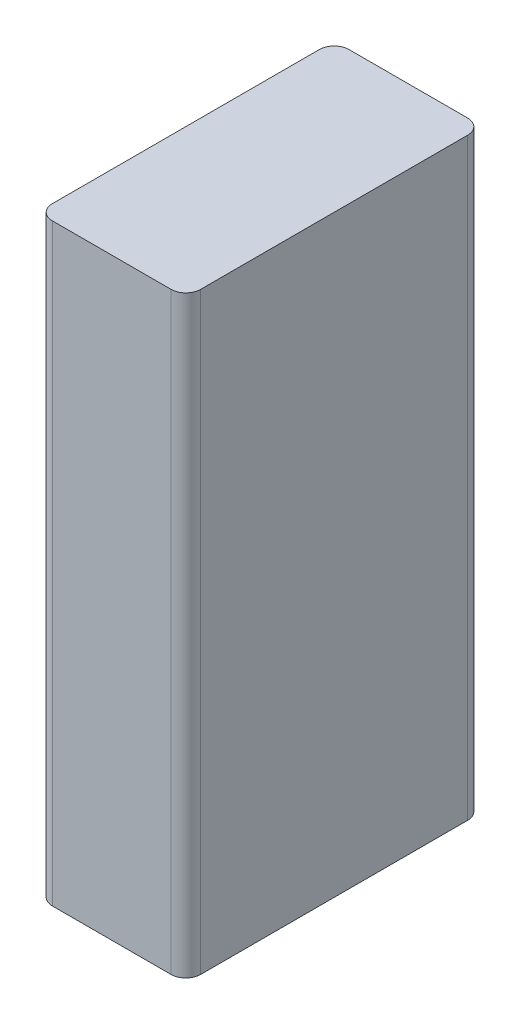
ISO-10303-21;
HEADER;
FILE_DESCRIPTION(('STEP AP214'),'2;1');
FILE_NAME('part.step','',(''),(''),'','','');
FILE_SCHEMA(('AUTOMOTIVE_DESIGN { 1 0 10303 214 1 1 1 1 }'));
ENDSEC;
DATA;
#1=APPLICATION_CONTEXT('core data for automotive mechanical design processes');
#2=APPLICATION_PROTOCOL_DEFINITION('international standard','automotive_design',2000,#1);
#3=PRODUCT_CONTEXT('',#1,'mechanical');
#4=PRODUCT('Part','Part','',(#3));
#5=PRODUCT_RELATED_PRODUCT_CATEGORY('part','',(#4));
#6=PRODUCT_DEFINITION_FORMATION('','',#4);
#7=PRODUCT_DEFINITION_CONTEXT('part definition',#1,'design');
#8=PRODUCT_DEFINITION('design','',#6,#7);
#9=PRODUCT_DEFINITION_SHAPE('','',#8);
#10=(LENGTH_UNIT() NAMED_UNIT(*) SI_UNIT(.MILLI.,.METRE.));
#11=(NAMED_UNIT(*) PLANE_ANGLE_UNIT() SI_UNIT($,.RADIAN.));
#12=(NAMED_UNIT(*) SI_UNIT($,.STERADIAN.) SOLID_ANGLE_UNIT());
#13=UNCERTAINTY_MEASURE_WITH_UNIT(LENGTH_MEASURE(1.E-05),#10,'distance_accuracy_value','');
#14=(GEOMETRIC_REPRESENTATION_CONTEXT(3) GLOBAL_UNCERTAINTY_ASSIGNED_CONTEXT((#13)) GLOBAL_UNIT_ASSIGNED_CONTEXT((#10,
#11,#12)) REPRESENTATION_CONTEXT('',''));
#15=CARTESIAN_POINT('',(0.,0.,0.));
#16=DIRECTION('',(0.,0.,1.));
#17=DIRECTION('',(1.,0.,0.));
#18=AXIS2_PLACEMENT_3D('',#15,#16,#17);
#19=CARTESIAN_POINT('',(5.,40.,10.));
#20=DIRECTION('',(-1.,0.,0.));
#21=DIRECTION('',(0.,0.,1.));
#22=AXIS2_PLACEMENT_3D('',#19,#20,#21);
#23=PLANE('',#22);
#24=DIRECTION('',(0.,0.,-1.));
#25=VECTOR('',#24,1.);
#26=CARTESIAN_POINT('',(5.,0.,10.));
#27=LINE('',#26,#25);
#28=CARTESIAN_POINT('',(5.,0.,9.));
#29=VERTEX_POINT('',#28);
#30=CARTESIAN_POINT('',(5.,0.,-9.));
#31=VERTEX_POINT('',#30);
#32=EDGE_CURVE('E126',#29,#31,#27,.T.);
#33=ORIENTED_EDGE('',*,*,#32,.T.);
#34=DIRECTION('',(0.,-1.,0.));
#35=VECTOR('',#34,1.);
#36=CARTESIAN_POINT('',(5.,40.,-9.));
#37=LINE('',#36,#35);
#38=CARTESIAN_POINT('',(5.,40.,-9.));
#39=VERTEX_POINT('',#38);
#40=EDGE_CURVE('E104',#31,#39,#37,.F.);
#41=ORIENTED_EDGE('',*,*,#40,.T.);
#42=DIRECTION('',(0.,0.,-1.));
#43=VECTOR('',#42,1.);
#44=CARTESIAN_POINT('',(5.,40.,10.));
#45=LINE('',#44,#43);
#46=CARTESIAN_POINT('',(5.,40.,9.));
#47=VERTEX_POINT('',#46);
#48=EDGE_CURVE('E135',#47,#39,#45,.T.);
#49=ORIENTED_EDGE('',*,*,#48,.F.);
#50=DIRECTION('',(0.,-1.,0.));
#51=VECTOR('',#50,1.);
#52=CARTESIAN_POINT('',(5.,40.,9.));
#53=LINE('',#52,#51);
#54=EDGE_CURVE('E109',#47,#29,#53,.T.);
#55=ORIENTED_EDGE('',*,*,#54,.T.);
#56=EDGE_LOOP('',(#33,#41,#49,#55));
#57=FACE_BOUND('',#56,.T.);
#58=ADVANCED_FACE('F34',(#57),#23,.F.);
#59=CARTESIAN_POINT('',(-5.,40.,-10.));
#60=DIRECTION('',(0.,0.,1.));
#61=DIRECTION('',(1.,0.,0.));
#62=AXIS2_PLACEMENT_3D('',#59,#60,#61);
#63=PLANE('',#62);
#64=DIRECTION('',(-1.,0.,0.));
#65=VECTOR('',#64,1.);
#66=CARTESIAN_POINT('',(-5.,40.,-10.));
#67=LINE('',#66,#65);
#68=CARTESIAN_POINT('',(4.,40.,-10.));
#69=VERTEX_POINT('',#68);
#70=CARTESIAN_POINT('',(-4.,40.,-10.));
#71=VERTEX_POINT('',#70);
#72=EDGE_CURVE('E119',#69,#71,#67,.T.);
#73=ORIENTED_EDGE('',*,*,#72,.F.);
#74=DIRECTION('',(0.,-1.,0.));
#75=VECTOR('',#74,1.);
#76=CARTESIAN_POINT('',(4.,40.,-10.));
#77=LINE('',#76,#75);
#78=CARTESIAN_POINT('',(4.,0.,-10.));
#79=VERTEX_POINT('',#78);
#80=EDGE_CURVE('E103',#69,#79,#77,.T.);
#81=ORIENTED_EDGE('',*,*,#80,.T.);
#82=DIRECTION('',(-1.,0.,0.));
#83=VECTOR('',#82,1.);
#84=CARTESIAN_POINT('',(-5.,0.,-10.));
#85=LINE('',#84,#83);
#86=CARTESIAN_POINT('',(-4.,0.,-10.));
#87=VERTEX_POINT('',#86);
#88=EDGE_CURVE('E116',#79,#87,#85,.T.);
#89=ORIENTED_EDGE('',*,*,#88,.T.);
#90=DIRECTION('',(0.,-1.,0.));
#91=VECTOR('',#90,1.);
#92=CARTESIAN_POINT('',(-4.,40.,-10.));
#93=LINE('',#92,#91);
#94=EDGE_CURVE('E121',#87,#71,#93,.F.);
#95=ORIENTED_EDGE('',*,*,#94,.T.);
#96=EDGE_LOOP('',(#73,#81,#89,#95));
#97=FACE_BOUND('',#96,.T.);
#98=ADVANCED_FACE('F115',(#97),#63,.F.);
#99=CARTESIAN_POINT('',(-5.,40.,10.));
#100=DIRECTION('',(1.,0.,0.));
#101=DIRECTION('',(0.,0.,-1.));
#102=AXIS2_PLACEMENT_3D('',#99,#100,#101);
#103=PLANE('',#102);
#104=DIRECTION('',(0.,0.,1.));
#105=VECTOR('',#104,1.);
#106=CARTESIAN_POINT('',(-5.,40.,10.));
#107=LINE('',#106,#105);
#108=CARTESIAN_POINT('',(-5.,40.,-9.));
#109=VERTEX_POINT('',#108);
#110=CARTESIAN_POINT('',(-5.,40.,9.));
#111=VERTEX_POINT('',#110);
#112=EDGE_CURVE('E169',#109,#111,#107,.T.);
#113=ORIENTED_EDGE('',*,*,#112,.F.);
#114=DIRECTION('',(0.,-1.,0.));
#115=VECTOR('',#114,1.);
#116=CARTESIAN_POINT('',(-5.,40.,-9.));
#117=LINE('',#116,#115);
#118=CARTESIAN_POINT('',(-5.,0.,-9.));
#119=VERTEX_POINT('',#118);
#120=EDGE_CURVE('E154',#109,#119,#117,.T.);
#121=ORIENTED_EDGE('',*,*,#120,.T.);
#122=DIRECTION('',(0.,0.,1.));
#123=VECTOR('',#122,1.);
#124=CARTESIAN_POINT('',(-5.,0.,10.));
#125=LINE('',#124,#123);
#126=CARTESIAN_POINT('',(-5.,0.,9.));
#127=VERTEX_POINT('',#126);
#128=EDGE_CURVE('E125',#119,#127,#125,.T.);
#129=ORIENTED_EDGE('',*,*,#128,.T.);
#130=DIRECTION('',(0.,-1.,0.));
#131=VECTOR('',#130,1.);
#132=CARTESIAN_POINT('',(-5.,40.,9.));
#133=LINE('',#132,#131);
#134=EDGE_CURVE('E152',#127,#111,#133,.F.);
#135=ORIENTED_EDGE('',*,*,#134,.T.);
#136=EDGE_LOOP('',(#113,#121,#129,#135));
#137=FACE_BOUND('',#136,.T.);
#138=ADVANCED_FACE('F180',(#137),#103,.F.);
#139=CARTESIAN_POINT('',(-5.,40.,10.));
#140=DIRECTION('',(0.,0.,-1.));
#141=DIRECTION('',(-1.,0.,0.));
#142=AXIS2_PLACEMENT_3D('',#139,#140,#141);
#143=PLANE('',#142);
#144=DIRECTION('',(1.,0.,0.));
#145=VECTOR('',#144,1.);
#146=CARTESIAN_POINT('',(-5.,0.,10.));
#147=LINE('',#146,#145);
#148=CARTESIAN_POINT('',(-4.,0.,10.));
#149=VERTEX_POINT('',#148);
#150=CARTESIAN_POINT('',(4.,0.,10.));
#151=VERTEX_POINT('',#150);
#152=EDGE_CURVE('E129',#149,#151,#147,.T.);
#153=ORIENTED_EDGE('',*,*,#152,.T.);
#154=DIRECTION('',(0.,-1.,0.));
#155=VECTOR('',#154,1.);
#156=CARTESIAN_POINT('',(4.,40.,10.));
#157=LINE('',#156,#155);
#158=CARTESIAN_POINT('',(4.,40.,10.));
#159=VERTEX_POINT('',#158);
#160=EDGE_CURVE('E11',#151,#159,#157,.F.);
#161=ORIENTED_EDGE('',*,*,#160,.T.);
#162=DIRECTION('',(1.,0.,0.));
#163=VECTOR('',#162,1.);
#164=CARTESIAN_POINT('',(-5.,40.,10.));
#165=LINE('',#164,#163);
#166=CARTESIAN_POINT('',(-4.,40.,10.));
#167=VERTEX_POINT('',#166);
#168=EDGE_CURVE('E136',#167,#159,#165,.T.);
#169=ORIENTED_EDGE('',*,*,#168,.F.);
#170=DIRECTION('',(0.,-1.,0.));
#171=VECTOR('',#170,1.);
#172=CARTESIAN_POINT('',(-4.,40.,10.));
#173=LINE('',#172,#171);
#174=EDGE_CURVE('E42',#167,#149,#173,.T.);
#175=ORIENTED_EDGE('',*,*,#174,.T.);
#176=EDGE_LOOP('',(#153,#161,#169,#175));
#177=FACE_BOUND('',#176,.T.);
#178=ADVANCED_FACE('F159',(#177),#143,.F.);
#179=CARTESIAN_POINT('',(0.,40.,0.));
#180=DIRECTION('',(0.,-1.,0.));
#181=DIRECTION('',(0.,0.,-1.));
#182=AXIS2_PLACEMENT_3D('',#179,#180,#181);
#183=PLANE('',#182);
#184=ORIENTED_EDGE('',*,*,#48,.T.);
#185=CARTESIAN_POINT('',(4.,40.,-9.));
#186=DIRECTION('',(0.,-1.,0.));
#187=DIRECTION('',(0.,0.,-1.));
#188=AXIS2_PLACEMENT_3D('',#185,#186,#187);
#189=CIRCLE('',#188,1.);
#190=EDGE_CURVE('E150',#39,#69,#189,.F.);
#191=ORIENTED_EDGE('',*,*,#190,.T.);
#192=ORIENTED_EDGE('',*,*,#72,.T.);
#193=CARTESIAN_POINT('',(-4.,40.,-9.));
#194=DIRECTION('',(0.,-1.,0.));
#195=DIRECTION('',(0.,0.,-1.));
#196=AXIS2_PLACEMENT_3D('',#193,#194,#195);
#197=CIRCLE('',#196,1.);
#198=EDGE_CURVE('E148',#71,#109,#197,.F.);
#199=ORIENTED_EDGE('',*,*,#198,.T.);
#200=ORIENTED_EDGE('',*,*,#112,.T.);
#201=CARTESIAN_POINT('',(-4.,40.,9.));
#202=DIRECTION('',(0.,-1.,0.));
#203=DIRECTION('',(0.,0.,-1.));
#204=AXIS2_PLACEMENT_3D('',#201,#202,#203);
#205=CIRCLE('',#204,1.);
#206=EDGE_CURVE('E54',#111,#167,#205,.F.);
#207=ORIENTED_EDGE('',*,*,#206,.T.);
#208=ORIENTED_EDGE('',*,*,#168,.T.);
#209=CARTESIAN_POINT('',(4.,40.,9.));
#210=DIRECTION('',(0.,-1.,0.));
#211=DIRECTION('',(0.,0.,-1.));
#212=AXIS2_PLACEMENT_3D('',#209,#210,#211);
#213=CIRCLE('',#212,1.);
#214=EDGE_CURVE('E146',#159,#47,#213,.F.);
#215=ORIENTED_EDGE('',*,*,#214,.T.);
#216=EDGE_LOOP('',(#184,#191,#192,#199,#200,#207,#208,#215));
#217=FACE_BOUND('',#216,.T.);
#218=ADVANCED_FACE('F172',(#217),#183,.F.);
#219=CARTESIAN_POINT('',(0.,0.,0.));
#220=DIRECTION('',(0.,-1.,0.));
#221=DIRECTION('',(0.,0.,-1.));
#222=AXIS2_PLACEMENT_3D('',#219,#220,#221);
#223=PLANE('',#222);
#224=ORIENTED_EDGE('',*,*,#88,.F.);
#225=CARTESIAN_POINT('',(4.,0.,-9.));
#226=DIRECTION('',(0.,-1.,0.));
#227=DIRECTION('',(0.,0.,-1.));
#228=AXIS2_PLACEMENT_3D('',#225,#226,#227);
#229=CIRCLE('',#228,1.);
#230=EDGE_CURVE('E99',#79,#31,#229,.T.);
#231=ORIENTED_EDGE('',*,*,#230,.T.);
#232=ORIENTED_EDGE('',*,*,#32,.F.);
#233=CARTESIAN_POINT('',(4.,0.,9.));
#234=DIRECTION('',(0.,-1.,0.));
#235=DIRECTION('',(0.,0.,-1.));
#236=AXIS2_PLACEMENT_3D('',#233,#234,#235);
#237=CIRCLE('',#236,1.);
#238=EDGE_CURVE('E139',#29,#151,#237,.T.);
#239=ORIENTED_EDGE('',*,*,#238,.T.);
#240=ORIENTED_EDGE('',*,*,#152,.F.);
#241=CARTESIAN_POINT('',(-4.,0.,9.));
#242=DIRECTION('',(0.,-1.,0.));
#243=DIRECTION('',(0.,0.,-1.));
#244=AXIS2_PLACEMENT_3D('',#241,#242,#243);
#245=CIRCLE('',#244,1.);
#246=EDGE_CURVE('E120',#149,#127,#245,.T.);
#247=ORIENTED_EDGE('',*,*,#246,.T.);
#248=ORIENTED_EDGE('',*,*,#128,.F.);
#249=CARTESIAN_POINT('',(-4.,0.,-9.));
#250=DIRECTION('',(0.,-1.,0.));
#251=DIRECTION('',(0.,0.,-1.));
#252=AXIS2_PLACEMENT_3D('',#249,#250,#251);
#253=CIRCLE('',#252,1.);
#254=EDGE_CURVE('E110',#119,#87,#253,.T.);
#255=ORIENTED_EDGE('',*,*,#254,.T.);
#256=EDGE_LOOP('',(#224,#231,#232,#239,#240,#247,#248,#255));
#257=FACE_BOUND('',#256,.T.);
#258=ADVANCED_FACE('F123',(#257),#223,.T.);
#259=CARTESIAN_POINT('',(4.,40.,-9.));
#260=DIRECTION('',(0.,-1.,0.));
#261=DIRECTION('',(0.,0.,-1.));
#262=AXIS2_PLACEMENT_3D('',#259,#260,#261);
#263=CYLINDRICAL_SURFACE('',#262,1.);
#264=ORIENTED_EDGE('',*,*,#190,.F.);
#265=ORIENTED_EDGE('',*,*,#40,.F.);
#266=ORIENTED_EDGE('',*,*,#230,.F.);
#267=ORIENTED_EDGE('',*,*,#80,.F.);
#268=EDGE_LOOP('',(#264,#265,#266,#267));
#269=FACE_BOUND('',#268,.T.);
#270=ADVANCED_FACE('F102',(#269),#263,.T.);
#271=CARTESIAN_POINT('',(-4.,40.,-9.));
#272=DIRECTION('',(0.,-1.,0.));
#273=DIRECTION('',(0.,0.,-1.));
#274=AXIS2_PLACEMENT_3D('',#271,#272,#273);
#275=CYLINDRICAL_SURFACE('',#274,1.);
#276=ORIENTED_EDGE('',*,*,#198,.F.);
#277=ORIENTED_EDGE('',*,*,#94,.F.);
#278=ORIENTED_EDGE('',*,*,#254,.F.);
#279=ORIENTED_EDGE('',*,*,#120,.F.);
#280=EDGE_LOOP('',(#276,#277,#278,#279));
#281=FACE_BOUND('',#280,.T.);
#282=ADVANCED_FACE('F192',(#281),#275,.T.);
#283=CARTESIAN_POINT('',(4.,40.,9.));
#284=DIRECTION('',(0.,-1.,0.));
#285=DIRECTION('',(0.,0.,-1.));
#286=AXIS2_PLACEMENT_3D('',#283,#284,#285);
#287=CYLINDRICAL_SURFACE('',#286,1.);
#288=ORIENTED_EDGE('',*,*,#214,.F.);
#289=ORIENTED_EDGE('',*,*,#160,.F.);
#290=ORIENTED_EDGE('',*,*,#238,.F.);
#291=ORIENTED_EDGE('',*,*,#54,.F.);
#292=EDGE_LOOP('',(#288,#289,#290,#291));
#293=FACE_BOUND('',#292,.T.);
#294=ADVANCED_FACE('F164',(#293),#287,.T.);
#295=CARTESIAN_POINT('',(-4.,40.,9.));
#296=DIRECTION('',(0.,-1.,0.));
#297=DIRECTION('',(0.,0.,-1.));
#298=AXIS2_PLACEMENT_3D('',#295,#296,#297);
#299=CYLINDRICAL_SURFACE('',#298,1.);
#300=ORIENTED_EDGE('',*,*,#206,.F.);
#301=ORIENTED_EDGE('',*,*,#134,.F.);
#302=ORIENTED_EDGE('',*,*,#246,.F.);
#303=ORIENTED_EDGE('',*,*,#174,.F.);
#304=EDGE_LOOP('',(#300,#301,#302,#303));
#305=FACE_BOUND('',#304,.T.);
#306=ADVANCED_FACE('F36',(#305),#299,.T.);
#307=CLOSED_SHELL('',(#58,#98,#138,#178,#218,#258,#270,#282,#294,#306));
#308=MANIFOLD_SOLID_BREP('B2',#307);
#309=ADVANCED_BREP_SHAPE_REPRESENTATION('',(#18,#308),#14);
#310=SHAPE_DEFINITION_REPRESENTATION(#9,#309);
ENDSEC;
END-ISO-10303-21;
